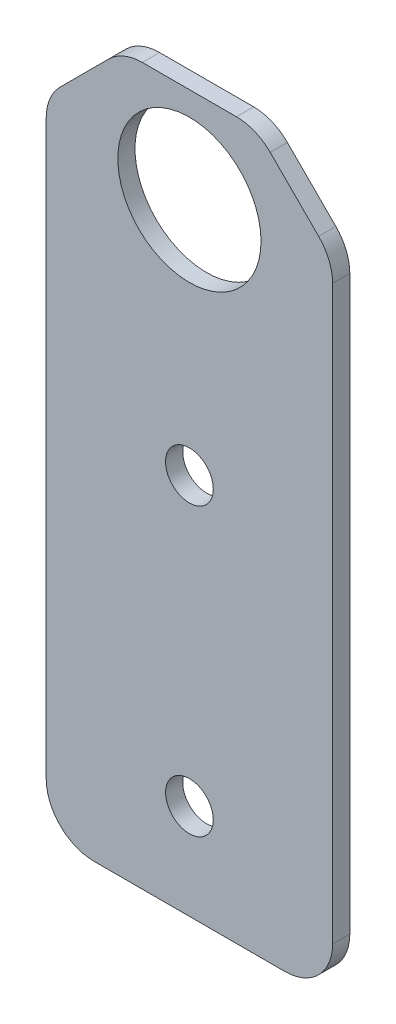
ISO-10303-21;
HEADER;
FILE_DESCRIPTION(('STEP AP214'),'2;1');
FILE_NAME('part.step','',(''),(''),'','','');
FILE_SCHEMA(('AUTOMOTIVE_DESIGN { 1 0 10303 214 1 1 1 1 }'));
ENDSEC;
DATA;
#1=APPLICATION_CONTEXT('core data for automotive mechanical design processes');
#2=APPLICATION_PROTOCOL_DEFINITION('international standard','automotive_design',2000,#1);
#3=PRODUCT_CONTEXT('',#1,'mechanical');
#4=PRODUCT('Part','Part','',(#3));
#5=PRODUCT_RELATED_PRODUCT_CATEGORY('part','',(#4));
#6=PRODUCT_DEFINITION_FORMATION('','',#4);
#7=PRODUCT_DEFINITION_CONTEXT('part definition',#1,'design');
#8=PRODUCT_DEFINITION('design','',#6,#7);
#9=PRODUCT_DEFINITION_SHAPE('','',#8);
#10=(LENGTH_UNIT() NAMED_UNIT(*) SI_UNIT(.MILLI.,.METRE.));
#11=(NAMED_UNIT(*) PLANE_ANGLE_UNIT() SI_UNIT($,.RADIAN.));
#12=(NAMED_UNIT(*) SI_UNIT($,.STERADIAN.) SOLID_ANGLE_UNIT());
#13=UNCERTAINTY_MEASURE_WITH_UNIT(LENGTH_MEASURE(1.E-05),#10,'distance_accuracy_value','');
#14=(GEOMETRIC_REPRESENTATION_CONTEXT(3) GLOBAL_UNCERTAINTY_ASSIGNED_CONTEXT((#13)) GLOBAL_UNIT_ASSIGNED_CONTEXT((#10,
#11,#12)) REPRESENTATION_CONTEXT('',''));
#15=CARTESIAN_POINT('',(0.,0.,0.));
#16=DIRECTION('',(0.,0.,1.));
#17=DIRECTION('',(1.,0.,0.));
#18=AXIS2_PLACEMENT_3D('',#15,#16,#17);
#19=CARTESIAN_POINT('',(0.,0.,1.143));
#20=DIRECTION('',(0.,0.,1.));
#21=DIRECTION('',(1.,0.,0.));
#22=AXIS2_PLACEMENT_3D('',#19,#20,#21);
#23=PLANE('',#22);
#24=DIRECTION('',(-1.,0.,0.));
#25=VECTOR('',#24,1.);
#26=CARTESIAN_POINT('',(-19.05,-44.45,1.143));
#27=LINE('',#26,#25);
#28=CARTESIAN_POINT('',(12.7,-44.45,1.143));
#29=VERTEX_POINT('',#28);
#30=CARTESIAN_POINT('',(-12.7,-44.45,1.143));
#31=VERTEX_POINT('',#30);
#32=EDGE_CURVE('E212',#29,#31,#27,.T.);
#33=ORIENTED_EDGE('',*,*,#32,.F.);
#34=CARTESIAN_POINT('',(12.7,-38.1,1.143));
#35=DIRECTION('',(0.,0.,1.));
#36=DIRECTION('',(1.,0.,0.));
#37=AXIS2_PLACEMENT_3D('',#34,#35,#36);
#38=CIRCLE('',#37,6.35);
#39=CARTESIAN_POINT('',(19.05,-38.1,1.143));
#40=VERTEX_POINT('',#39);
#41=EDGE_CURVE('E41',#29,#40,#38,.T.);
#42=ORIENTED_EDGE('',*,*,#41,.T.);
#43=DIRECTION('',(0.,1.,0.));
#44=VECTOR('',#43,1.);
#45=CARTESIAN_POINT('',(19.05,50.8,1.143));
#46=LINE('',#45,#44);
#47=CARTESIAN_POINT('',(19.05,38.0097438789308,1.143));
#48=VERTEX_POINT('',#47);
#49=EDGE_CURVE('E150',#40,#48,#46,.T.);
#50=ORIENTED_EDGE('',*,*,#49,.T.);
#51=CARTESIAN_POINT('',(12.7,38.0097438789308,1.143));
#52=DIRECTION('',(0.,0.,1.));
#53=DIRECTION('',(1.,0.,0.));
#54=AXIS2_PLACEMENT_3D('',#51,#52,#53);
#55=CIRCLE('',#54,6.35);
#56=CARTESIAN_POINT('',(17.1901280605346,42.4998719394654,1.143));
#57=VERTEX_POINT('',#56);
#58=EDGE_CURVE('E180',#48,#57,#55,.T.);
#59=ORIENTED_EDGE('',*,*,#58,.T.);
#60=DIRECTION('',(0.707106781186546,-0.707106781186549,0.));
#61=VECTOR('',#60,1.);
#62=CARTESIAN_POINT('',(29.845,29.8449999999999,1.143));
#63=LINE('',#62,#61);
#64=CARTESIAN_POINT('',(10.7498719394654,48.9401280605345,1.143));
#65=VERTEX_POINT('',#64);
#66=EDGE_CURVE('E165',#57,#65,#63,.F.);
#67=ORIENTED_EDGE('',*,*,#66,.T.);
#68=CARTESIAN_POINT('',(6.25974387893086,44.45,1.143));
#69=DIRECTION('',(0.,0.,1.));
#70=DIRECTION('',(1.,0.,0.));
#71=AXIS2_PLACEMENT_3D('',#68,#69,#70);
#72=CIRCLE('',#71,6.35);
#73=CARTESIAN_POINT('',(6.25974387893086,50.8,1.143));
#74=VERTEX_POINT('',#73);
#75=EDGE_CURVE('E178',#65,#74,#72,.T.);
#76=ORIENTED_EDGE('',*,*,#75,.T.);
#77=DIRECTION('',(-1.,0.,0.));
#78=VECTOR('',#77,1.);
#79=CARTESIAN_POINT('',(-19.05,50.8,1.143));
#80=LINE('',#79,#78);
#81=CARTESIAN_POINT('',(-6.25974387893081,50.8,1.143));
#82=VERTEX_POINT('',#81);
#83=EDGE_CURVE('E153',#74,#82,#80,.T.);
#84=ORIENTED_EDGE('',*,*,#83,.T.);
#85=CARTESIAN_POINT('',(-6.25974387893081,44.45,1.143));
#86=DIRECTION('',(0.,0.,1.));
#87=DIRECTION('',(1.,0.,0.));
#88=AXIS2_PLACEMENT_3D('',#85,#86,#87);
#89=CIRCLE('',#88,6.35);
#90=CARTESIAN_POINT('',(-10.7498719394654,48.9401280605346,1.143));
#91=VERTEX_POINT('',#90);
#92=EDGE_CURVE('E141',#82,#91,#89,.T.);
#93=ORIENTED_EDGE('',*,*,#92,.T.);
#94=DIRECTION('',(0.707106781186549,0.707106781186546,0.));
#95=VECTOR('',#94,1.);
#96=CARTESIAN_POINT('',(-29.845,29.845,1.143));
#97=LINE('',#96,#95);
#98=CARTESIAN_POINT('',(-17.1901280605346,42.4998719394654,1.143));
#99=VERTEX_POINT('',#98);
#100=EDGE_CURVE('E168',#91,#99,#97,.F.);
#101=ORIENTED_EDGE('',*,*,#100,.T.);
#102=CARTESIAN_POINT('',(-12.7,38.0097438789308,1.143));
#103=DIRECTION('',(0.,0.,1.));
#104=DIRECTION('',(1.,0.,0.));
#105=AXIS2_PLACEMENT_3D('',#102,#103,#104);
#106=CIRCLE('',#105,6.35);
#107=CARTESIAN_POINT('',(-19.05,38.0097438789308,1.143));
#108=VERTEX_POINT('',#107);
#109=EDGE_CURVE('E176',#99,#108,#106,.T.);
#110=ORIENTED_EDGE('',*,*,#109,.T.);
#111=DIRECTION('',(0.,-1.,0.));
#112=VECTOR('',#111,1.);
#113=CARTESIAN_POINT('',(-19.05,50.8,1.143));
#114=LINE('',#113,#112);
#115=CARTESIAN_POINT('',(-19.05,-38.1,1.143));
#116=VERTEX_POINT('',#115);
#117=EDGE_CURVE('E140',#108,#116,#114,.T.);
#118=ORIENTED_EDGE('',*,*,#117,.T.);
#119=CARTESIAN_POINT('',(-12.7,-38.1,1.143));
#120=DIRECTION('',(0.,0.,1.));
#121=DIRECTION('',(1.,0.,0.));
#122=AXIS2_PLACEMENT_3D('',#119,#120,#121);
#123=CIRCLE('',#122,6.35);
#124=EDGE_CURVE('E48',#116,#31,#123,.T.);
#125=ORIENTED_EDGE('',*,*,#124,.T.);
#126=EDGE_LOOP('',(#33,#42,#50,#59,#67,#76,#84,#93,#101,#110,#118,#125));
#127=FACE_BOUND('',#126,.T.);
#128=CARTESIAN_POINT('',(0.,6.34999999999999,1.143));
#129=DIRECTION('',(0.,0.,1.));
#130=DIRECTION('',(1.,0.,0.));
#131=AXIS2_PLACEMENT_3D('',#128,#129,#130);
#132=CIRCLE('',#131,3.175);
#133=CARTESIAN_POINT('',(3.175,6.34999999999999,1.143));
#134=VERTEX_POINT('',#133);
#135=EDGE_CURVE('E234',#134,#134,#132,.T.);
#136=ORIENTED_EDGE('',*,*,#135,.F.);
#137=EDGE_LOOP('',(#136));
#138=FACE_BOUND('',#137,.T.);
#139=CARTESIAN_POINT('',(0.,-31.75,1.143));
#140=DIRECTION('',(0.,0.,1.));
#141=DIRECTION('',(1.,0.,0.));
#142=AXIS2_PLACEMENT_3D('',#139,#140,#141);
#143=CIRCLE('',#142,3.175);
#144=CARTESIAN_POINT('',(3.175,-31.75,1.143));
#145=VERTEX_POINT('',#144);
#146=EDGE_CURVE('E240',#145,#145,#143,.T.);
#147=ORIENTED_EDGE('',*,*,#146,.F.);
#148=EDGE_LOOP('',(#147));
#149=FACE_BOUND('',#148,.T.);
#150=CARTESIAN_POINT('',(0.,38.1,1.143));
#151=DIRECTION('',(0.,0.,1.));
#152=DIRECTION('',(1.,0.,0.));
#153=AXIS2_PLACEMENT_3D('',#150,#151,#152);
#154=CIRCLE('',#153,9.525);
#155=CARTESIAN_POINT('',(9.525,38.1,1.143));
#156=VERTEX_POINT('',#155);
#157=EDGE_CURVE('E227',#156,#156,#154,.T.);
#158=ORIENTED_EDGE('',*,*,#157,.F.);
#159=EDGE_LOOP('',(#158));
#160=FACE_BOUND('',#159,.T.);
#161=ADVANCED_FACE('F33',(#127,#138,#149,#160),#23,.T.);
#162=CARTESIAN_POINT('',(0.,0.,-1.143));
#163=DIRECTION('',(0.,0.,1.));
#164=DIRECTION('',(1.,0.,0.));
#165=AXIS2_PLACEMENT_3D('',#162,#163,#164);
#166=PLANE('',#165);
#167=CARTESIAN_POINT('',(0.,6.34999999999999,-1.143));
#168=DIRECTION('',(0.,0.,1.));
#169=DIRECTION('',(1.,0.,0.));
#170=AXIS2_PLACEMENT_3D('',#167,#168,#169);
#171=CIRCLE('',#170,3.175);
#172=CARTESIAN_POINT('',(3.175,6.34999999999999,-1.143));
#173=VERTEX_POINT('',#172);
#174=EDGE_CURVE('E232',#173,#173,#171,.T.);
#175=ORIENTED_EDGE('',*,*,#174,.T.);
#176=EDGE_LOOP('',(#175));
#177=FACE_BOUND('',#176,.T.);
#178=DIRECTION('',(0.,1.,0.));
#179=VECTOR('',#178,1.);
#180=CARTESIAN_POINT('',(19.05,50.8,-1.143));
#181=LINE('',#180,#179);
#182=CARTESIAN_POINT('',(19.05,-38.1,-1.143));
#183=VERTEX_POINT('',#182);
#184=CARTESIAN_POINT('',(19.05,38.0097438789308,-1.143));
#185=VERTEX_POINT('',#184);
#186=EDGE_CURVE('E156',#183,#185,#181,.T.);
#187=ORIENTED_EDGE('',*,*,#186,.F.);
#188=CARTESIAN_POINT('',(12.7,-38.1,-1.143));
#189=DIRECTION('',(0.,0.,1.));
#190=DIRECTION('',(1.,0.,0.));
#191=AXIS2_PLACEMENT_3D('',#188,#189,#190);
#192=CIRCLE('',#191,6.35);
#193=CARTESIAN_POINT('',(12.7,-44.45,-1.143));
#194=VERTEX_POINT('',#193);
#195=EDGE_CURVE('E202',#183,#194,#192,.F.);
#196=ORIENTED_EDGE('',*,*,#195,.T.);
#197=DIRECTION('',(-1.,0.,0.));
#198=VECTOR('',#197,1.);
#199=CARTESIAN_POINT('',(-19.05,-44.45,-1.143));
#200=LINE('',#199,#198);
#201=CARTESIAN_POINT('',(-12.7,-44.45,-1.143));
#202=VERTEX_POINT('',#201);
#203=EDGE_CURVE('E221',#194,#202,#200,.T.);
#204=ORIENTED_EDGE('',*,*,#203,.T.);
#205=CARTESIAN_POINT('',(-12.7,-38.1,-1.143));
#206=DIRECTION('',(0.,0.,1.));
#207=DIRECTION('',(1.,0.,0.));
#208=AXIS2_PLACEMENT_3D('',#205,#206,#207);
#209=CIRCLE('',#208,6.35);
#210=CARTESIAN_POINT('',(-19.05,-38.1,-1.143));
#211=VERTEX_POINT('',#210);
#212=EDGE_CURVE('E149',#202,#211,#209,.F.);
#213=ORIENTED_EDGE('',*,*,#212,.T.);
#214=DIRECTION('',(0.,-1.,0.));
#215=VECTOR('',#214,1.);
#216=CARTESIAN_POINT('',(-19.05,50.8,-1.143));
#217=LINE('',#216,#215);
#218=CARTESIAN_POINT('',(-19.05,38.0097438789308,-1.143));
#219=VERTEX_POINT('',#218);
#220=EDGE_CURVE('E139',#219,#211,#217,.T.);
#221=ORIENTED_EDGE('',*,*,#220,.F.);
#222=CARTESIAN_POINT('',(-12.7,38.0097438789308,-1.143));
#223=DIRECTION('',(0.,0.,1.));
#224=DIRECTION('',(1.,0.,0.));
#225=AXIS2_PLACEMENT_3D('',#222,#223,#224);
#226=CIRCLE('',#225,6.35);
#227=CARTESIAN_POINT('',(-17.1901280605346,42.4998719394654,-1.143));
#228=VERTEX_POINT('',#227);
#229=EDGE_CURVE('E122',#219,#228,#226,.F.);
#230=ORIENTED_EDGE('',*,*,#229,.T.);
#231=DIRECTION('',(-0.707106781186549,-0.707106781186546,0.));
#232=VECTOR('',#231,1.);
#233=CARTESIAN_POINT('',(-19.05,40.64,-1.143));
#234=LINE('',#233,#232);
#235=CARTESIAN_POINT('',(-10.7498719394654,48.9401280605346,-1.143));
#236=VERTEX_POINT('',#235);
#237=EDGE_CURVE('E163',#228,#236,#234,.F.);
#238=ORIENTED_EDGE('',*,*,#237,.T.);
#239=CARTESIAN_POINT('',(-6.25974387893081,44.45,-1.143));
#240=DIRECTION('',(0.,0.,1.));
#241=DIRECTION('',(1.,0.,0.));
#242=AXIS2_PLACEMENT_3D('',#239,#240,#241);
#243=CIRCLE('',#242,6.35);
#244=CARTESIAN_POINT('',(-6.25974387893081,50.8,-1.143));
#245=VERTEX_POINT('',#244);
#246=EDGE_CURVE('E133',#236,#245,#243,.F.);
#247=ORIENTED_EDGE('',*,*,#246,.T.);
#248=DIRECTION('',(-1.,0.,0.));
#249=VECTOR('',#248,1.);
#250=CARTESIAN_POINT('',(-19.05,50.8,-1.143));
#251=LINE('',#250,#249);
#252=CARTESIAN_POINT('',(6.25974387893086,50.8,-1.143));
#253=VERTEX_POINT('',#252);
#254=EDGE_CURVE('E151',#253,#245,#251,.T.);
#255=ORIENTED_EDGE('',*,*,#254,.F.);
#256=CARTESIAN_POINT('',(6.25974387893086,44.45,-1.143));
#257=DIRECTION('',(0.,0.,1.));
#258=DIRECTION('',(1.,0.,0.));
#259=AXIS2_PLACEMENT_3D('',#256,#257,#258);
#260=CIRCLE('',#259,6.35);
#261=CARTESIAN_POINT('',(10.7498719394654,48.9401280605345,-1.143));
#262=VERTEX_POINT('',#261);
#263=EDGE_CURVE('E132',#253,#262,#260,.F.);
#264=ORIENTED_EDGE('',*,*,#263,.T.);
#265=DIRECTION('',(-0.707106781186546,0.707106781186549,0.));
#266=VECTOR('',#265,1.);
#267=CARTESIAN_POINT('',(8.89000000000001,50.8,-1.143));
#268=LINE('',#267,#266);
#269=CARTESIAN_POINT('',(17.1901280605346,42.4998719394654,-1.143));
#270=VERTEX_POINT('',#269);
#271=EDGE_CURVE('E160',#262,#270,#268,.F.);
#272=ORIENTED_EDGE('',*,*,#271,.T.);
#273=CARTESIAN_POINT('',(12.7,38.0097438789308,-1.143));
#274=DIRECTION('',(0.,0.,1.));
#275=DIRECTION('',(1.,0.,0.));
#276=AXIS2_PLACEMENT_3D('',#273,#274,#275);
#277=CIRCLE('',#276,6.35);
#278=EDGE_CURVE('E142',#270,#185,#277,.F.);
#279=ORIENTED_EDGE('',*,*,#278,.T.);
#280=EDGE_LOOP('',(#187,#196,#204,#213,#221,#230,#238,#247,#255,#264,#272,#279));
#281=FACE_BOUND('',#280,.T.);
#282=CARTESIAN_POINT('',(0.,-31.75,-1.143));
#283=DIRECTION('',(0.,0.,1.));
#284=DIRECTION('',(1.,0.,0.));
#285=AXIS2_PLACEMENT_3D('',#282,#283,#284);
#286=CIRCLE('',#285,3.175);
#287=CARTESIAN_POINT('',(3.175,-31.75,-1.143));
#288=VERTEX_POINT('',#287);
#289=EDGE_CURVE('E237',#288,#288,#286,.T.);
#290=ORIENTED_EDGE('',*,*,#289,.T.);
#291=EDGE_LOOP('',(#290));
#292=FACE_BOUND('',#291,.T.);
#293=CARTESIAN_POINT('',(0.,38.1,-1.143));
#294=DIRECTION('',(0.,0.,1.));
#295=DIRECTION('',(1.,0.,0.));
#296=AXIS2_PLACEMENT_3D('',#293,#294,#295);
#297=CIRCLE('',#296,9.525);
#298=CARTESIAN_POINT('',(9.525,38.1,-1.143));
#299=VERTEX_POINT('',#298);
#300=EDGE_CURVE('E224',#299,#299,#297,.T.);
#301=ORIENTED_EDGE('',*,*,#300,.T.);
#302=EDGE_LOOP('',(#301));
#303=FACE_BOUND('',#302,.T.);
#304=ADVANCED_FACE('F145',(#177,#281,#292,#303),#166,.F.);
#305=CARTESIAN_POINT('',(19.05,50.8,1.143));
#306=DIRECTION('',(-1.,0.,0.));
#307=DIRECTION('',(0.,-1.,0.));
#308=AXIS2_PLACEMENT_3D('',#305,#306,#307);
#309=PLANE('',#308);
#310=ORIENTED_EDGE('',*,*,#49,.F.);
#311=DIRECTION('',(0.,0.,-1.));
#312=VECTOR('',#311,1.);
#313=CARTESIAN_POINT('',(19.05,-38.1,1.143));
#314=LINE('',#313,#312);
#315=EDGE_CURVE('E198',#40,#183,#314,.T.);
#316=ORIENTED_EDGE('',*,*,#315,.T.);
#317=ORIENTED_EDGE('',*,*,#186,.T.);
#318=DIRECTION('',(0.,0.,-1.));
#319=VECTOR('',#318,1.);
#320=CARTESIAN_POINT('',(19.05,38.0097438789308,1.143));
#321=LINE('',#320,#319);
#322=EDGE_CURVE('E182',#185,#48,#321,.F.);
#323=ORIENTED_EDGE('',*,*,#322,.T.);
#324=EDGE_LOOP('',(#310,#316,#317,#323));
#325=FACE_BOUND('',#324,.T.);
#326=ADVANCED_FACE('F217',(#325),#309,.F.);
#327=CARTESIAN_POINT('',(-19.05,50.8,1.143));
#328=DIRECTION('',(0.,-1.,0.));
#329=DIRECTION('',(0.,0.,-1.));
#330=AXIS2_PLACEMENT_3D('',#327,#328,#329);
#331=PLANE('',#330);
#332=ORIENTED_EDGE('',*,*,#83,.F.);
#333=DIRECTION('',(0.,0.,1.));
#334=VECTOR('',#333,1.);
#335=CARTESIAN_POINT('',(6.25974387893086,50.8,-1.143));
#336=LINE('',#335,#334);
#337=EDGE_CURVE('E192',#74,#253,#336,.F.);
#338=ORIENTED_EDGE('',*,*,#337,.T.);
#339=ORIENTED_EDGE('',*,*,#254,.T.);
#340=DIRECTION('',(0.,0.,-1.));
#341=VECTOR('',#340,1.);
#342=CARTESIAN_POINT('',(-6.25974387893081,50.8,1.143));
#343=LINE('',#342,#341);
#344=EDGE_CURVE('E189',#245,#82,#343,.F.);
#345=ORIENTED_EDGE('',*,*,#344,.T.);
#346=EDGE_LOOP('',(#332,#338,#339,#345));
#347=FACE_BOUND('',#346,.T.);
#348=ADVANCED_FACE('F262',(#347),#331,.F.);
#349=CARTESIAN_POINT('',(-19.05,50.8,1.143));
#350=DIRECTION('',(1.,0.,0.));
#351=DIRECTION('',(0.,1.,0.));
#352=AXIS2_PLACEMENT_3D('',#349,#350,#351);
#353=PLANE('',#352);
#354=ORIENTED_EDGE('',*,*,#220,.T.);
#355=DIRECTION('',(0.,0.,1.));
#356=VECTOR('',#355,1.);
#357=CARTESIAN_POINT('',(-19.05,-38.1,1.143));
#358=LINE('',#357,#356);
#359=EDGE_CURVE('E11',#211,#116,#358,.T.);
#360=ORIENTED_EDGE('',*,*,#359,.T.);
#361=ORIENTED_EDGE('',*,*,#117,.F.);
#362=DIRECTION('',(0.,0.,1.));
#363=VECTOR('',#362,1.);
#364=CARTESIAN_POINT('',(-19.05,38.0097438789308,-1.143));
#365=LINE('',#364,#363);
#366=EDGE_CURVE('E126',#108,#219,#365,.F.);
#367=ORIENTED_EDGE('',*,*,#366,.T.);
#368=EDGE_LOOP('',(#354,#360,#361,#367));
#369=FACE_BOUND('',#368,.T.);
#370=ADVANCED_FACE('F138',(#369),#353,.F.);
#371=CARTESIAN_POINT('',(0.,-31.75,1.143));
#372=DIRECTION('',(0.,0.,-1.));
#373=DIRECTION('',(-1.,0.,0.));
#374=AXIS2_PLACEMENT_3D('',#371,#372,#373);
#375=CYLINDRICAL_SURFACE('',#374,3.175);
#376=ORIENTED_EDGE('',*,*,#146,.T.);
#377=EDGE_LOOP('',(#376));
#378=FACE_BOUND('',#377,.T.);
#379=ORIENTED_EDGE('',*,*,#289,.F.);
#380=EDGE_LOOP('',(#379));
#381=FACE_BOUND('',#380,.T.);
#382=ADVANCED_FACE('F292',(#378,#381),#375,.F.);
#383=CARTESIAN_POINT('',(0.,6.34999999999999,1.143));
#384=DIRECTION('',(0.,0.,-1.));
#385=DIRECTION('',(-1.,0.,0.));
#386=AXIS2_PLACEMENT_3D('',#383,#384,#385);
#387=CYLINDRICAL_SURFACE('',#386,3.175);
#388=ORIENTED_EDGE('',*,*,#135,.T.);
#389=EDGE_LOOP('',(#388));
#390=FACE_BOUND('',#389,.T.);
#391=ORIENTED_EDGE('',*,*,#174,.F.);
#392=EDGE_LOOP('',(#391));
#393=FACE_BOUND('',#392,.T.);
#394=ADVANCED_FACE('F280',(#390,#393),#387,.F.);
#395=CARTESIAN_POINT('',(0.,38.1,1.143));
#396=DIRECTION('',(0.,0.,-1.));
#397=DIRECTION('',(-1.,0.,0.));
#398=AXIS2_PLACEMENT_3D('',#395,#396,#397);
#399=CYLINDRICAL_SURFACE('',#398,9.525);
#400=ORIENTED_EDGE('',*,*,#157,.T.);
#401=EDGE_LOOP('',(#400));
#402=FACE_BOUND('',#401,.T.);
#403=ORIENTED_EDGE('',*,*,#300,.F.);
#404=EDGE_LOOP('',(#403));
#405=FACE_BOUND('',#404,.T.);
#406=ADVANCED_FACE('F273',(#402,#405),#399,.F.);
#407=CARTESIAN_POINT('',(-19.05,40.64,1.143));
#408=DIRECTION('',(0.707106781186546,-0.707106781186549,0.));
#409=DIRECTION('',(0.,0.,-1.));
#410=AXIS2_PLACEMENT_3D('',#407,#408,#409);
#411=PLANE('',#410);
#412=ORIENTED_EDGE('',*,*,#237,.F.);
#413=DIRECTION('',(0.,0.,-1.));
#414=VECTOR('',#413,1.);
#415=CARTESIAN_POINT('',(-17.1901280605346,42.4998719394654,1.143));
#416=LINE('',#415,#414);
#417=EDGE_CURVE('E127',#228,#99,#416,.F.);
#418=ORIENTED_EDGE('',*,*,#417,.T.);
#419=ORIENTED_EDGE('',*,*,#100,.F.);
#420=DIRECTION('',(0.,0.,1.));
#421=VECTOR('',#420,1.);
#422=CARTESIAN_POINT('',(-10.7498719394654,48.9401280605346,-1.143));
#423=LINE('',#422,#421);
#424=EDGE_CURVE('E195',#91,#236,#423,.F.);
#425=ORIENTED_EDGE('',*,*,#424,.T.);
#426=EDGE_LOOP('',(#412,#418,#419,#425));
#427=FACE_BOUND('',#426,.T.);
#428=ADVANCED_FACE('F271',(#427),#411,.F.);
#429=CARTESIAN_POINT('',(8.89000000000001,50.8,1.143));
#430=DIRECTION('',(-0.707106781186549,-0.707106781186546,0.));
#431=DIRECTION('',(0.,0.,-1.));
#432=AXIS2_PLACEMENT_3D('',#429,#430,#431);
#433=PLANE('',#432);
#434=ORIENTED_EDGE('',*,*,#66,.F.);
#435=DIRECTION('',(0.,0.,1.));
#436=VECTOR('',#435,1.);
#437=CARTESIAN_POINT('',(17.1901280605346,42.4998719394654,-1.143));
#438=LINE('',#437,#436);
#439=EDGE_CURVE('E187',#57,#270,#438,.F.);
#440=ORIENTED_EDGE('',*,*,#439,.T.);
#441=ORIENTED_EDGE('',*,*,#271,.F.);
#442=DIRECTION('',(0.,0.,-1.));
#443=VECTOR('',#442,1.);
#444=CARTESIAN_POINT('',(10.7498719394654,48.9401280605345,1.143));
#445=LINE('',#444,#443);
#446=EDGE_CURVE('E185',#262,#65,#445,.F.);
#447=ORIENTED_EDGE('',*,*,#446,.T.);
#448=EDGE_LOOP('',(#434,#440,#441,#447));
#449=FACE_BOUND('',#448,.T.);
#450=ADVANCED_FACE('F255',(#449),#433,.F.);
#451=CARTESIAN_POINT('',(12.7,38.0097438789308,1.143));
#452=DIRECTION('',(0.,0.,1.));
#453=DIRECTION('',(1.,0.,0.));
#454=AXIS2_PLACEMENT_3D('',#451,#452,#453);
#455=CYLINDRICAL_SURFACE('',#454,6.35);
#456=ORIENTED_EDGE('',*,*,#278,.F.);
#457=ORIENTED_EDGE('',*,*,#439,.F.);
#458=ORIENTED_EDGE('',*,*,#58,.F.);
#459=ORIENTED_EDGE('',*,*,#322,.F.);
#460=EDGE_LOOP('',(#456,#457,#458,#459));
#461=FACE_BOUND('',#460,.T.);
#462=ADVANCED_FACE('F251',(#461),#455,.T.);
#463=CARTESIAN_POINT('',(6.25974387893086,44.45,1.143));
#464=DIRECTION('',(0.,0.,-1.));
#465=DIRECTION('',(-1.,0.,0.));
#466=AXIS2_PLACEMENT_3D('',#463,#464,#465);
#467=CYLINDRICAL_SURFACE('',#466,6.35);
#468=ORIENTED_EDGE('',*,*,#75,.F.);
#469=ORIENTED_EDGE('',*,*,#446,.F.);
#470=ORIENTED_EDGE('',*,*,#263,.F.);
#471=ORIENTED_EDGE('',*,*,#337,.F.);
#472=EDGE_LOOP('',(#468,#469,#470,#471));
#473=FACE_BOUND('',#472,.T.);
#474=ADVANCED_FACE('F258',(#473),#467,.T.);
#475=CARTESIAN_POINT('',(-12.7,38.0097438789308,1.143));
#476=DIRECTION('',(0.,0.,-1.));
#477=DIRECTION('',(-1.,0.,0.));
#478=AXIS2_PLACEMENT_3D('',#475,#476,#477);
#479=CYLINDRICAL_SURFACE('',#478,6.35);
#480=ORIENTED_EDGE('',*,*,#109,.F.);
#481=ORIENTED_EDGE('',*,*,#417,.F.);
#482=ORIENTED_EDGE('',*,*,#229,.F.);
#483=ORIENTED_EDGE('',*,*,#366,.F.);
#484=EDGE_LOOP('',(#480,#481,#482,#483));
#485=FACE_BOUND('',#484,.T.);
#486=ADVANCED_FACE('F125',(#485),#479,.T.);
#487=CARTESIAN_POINT('',(-6.25974387893081,44.45,1.143));
#488=DIRECTION('',(0.,0.,1.));
#489=DIRECTION('',(1.,0.,0.));
#490=AXIS2_PLACEMENT_3D('',#487,#488,#489);
#491=CYLINDRICAL_SURFACE('',#490,6.35);
#492=ORIENTED_EDGE('',*,*,#246,.F.);
#493=ORIENTED_EDGE('',*,*,#424,.F.);
#494=ORIENTED_EDGE('',*,*,#92,.F.);
#495=ORIENTED_EDGE('',*,*,#344,.F.);
#496=EDGE_LOOP('',(#492,#493,#494,#495));
#497=FACE_BOUND('',#496,.T.);
#498=ADVANCED_FACE('F267',(#497),#491,.T.);
#499=CARTESIAN_POINT('',(-19.05,-44.45,-1.143));
#500=DIRECTION('',(0.,1.,0.));
#501=DIRECTION('',(-1.,0.,0.));
#502=AXIS2_PLACEMENT_3D('',#499,#500,#501);
#503=PLANE('',#502);
#504=ORIENTED_EDGE('',*,*,#203,.F.);
#505=DIRECTION('',(0.,0.,-1.));
#506=VECTOR('',#505,1.);
#507=CARTESIAN_POINT('',(12.7,-44.45,-1.143));
#508=LINE('',#507,#506);
#509=EDGE_CURVE('E206',#194,#29,#508,.F.);
#510=ORIENTED_EDGE('',*,*,#509,.T.);
#511=ORIENTED_EDGE('',*,*,#32,.T.);
#512=DIRECTION('',(0.,0.,1.));
#513=VECTOR('',#512,1.);
#514=CARTESIAN_POINT('',(-12.7,-44.45,-1.143));
#515=LINE('',#514,#513);
#516=EDGE_CURVE('E204',#31,#202,#515,.F.);
#517=ORIENTED_EDGE('',*,*,#516,.T.);
#518=EDGE_LOOP('',(#504,#510,#511,#517));
#519=FACE_BOUND('',#518,.T.);
#520=ADVANCED_FACE('F223',(#519),#503,.F.);
#521=CARTESIAN_POINT('',(12.7,-38.1,1.143));
#522=DIRECTION('',(0.,0.,-1.));
#523=DIRECTION('',(-1.,0.,0.));
#524=AXIS2_PLACEMENT_3D('',#521,#522,#523);
#525=CYLINDRICAL_SURFACE('',#524,6.35);
#526=ORIENTED_EDGE('',*,*,#41,.F.);
#527=ORIENTED_EDGE('',*,*,#509,.F.);
#528=ORIENTED_EDGE('',*,*,#195,.F.);
#529=ORIENTED_EDGE('',*,*,#315,.F.);
#530=EDGE_LOOP('',(#526,#527,#528,#529));
#531=FACE_BOUND('',#530,.T.);
#532=ADVANCED_FACE('F219',(#531),#525,.T.);
#533=CARTESIAN_POINT('',(-12.7,-38.1,1.143));
#534=DIRECTION('',(0.,0.,1.));
#535=DIRECTION('',(1.,0.,0.));
#536=AXIS2_PLACEMENT_3D('',#533,#534,#535);
#537=CYLINDRICAL_SURFACE('',#536,6.35);
#538=ORIENTED_EDGE('',*,*,#212,.F.);
#539=ORIENTED_EDGE('',*,*,#516,.F.);
#540=ORIENTED_EDGE('',*,*,#124,.F.);
#541=ORIENTED_EDGE('',*,*,#359,.F.);
#542=EDGE_LOOP('',(#538,#539,#540,#541));
#543=FACE_BOUND('',#542,.T.);
#544=ADVANCED_FACE('F35',(#543),#537,.T.);
#545=CLOSED_SHELL('',(#161,#304,#326,#348,#370,#382,#394,#406,#428,#450,#462,#474,#486,#498,
#520,#532,#544));
#546=MANIFOLD_SOLID_BREP('B2',#545);
#547=ADVANCED_BREP_SHAPE_REPRESENTATION('',(#18,#546),#14);
#548=SHAPE_DEFINITION_REPRESENTATION(#9,#547);
ENDSEC;
END-ISO-10303-21;
